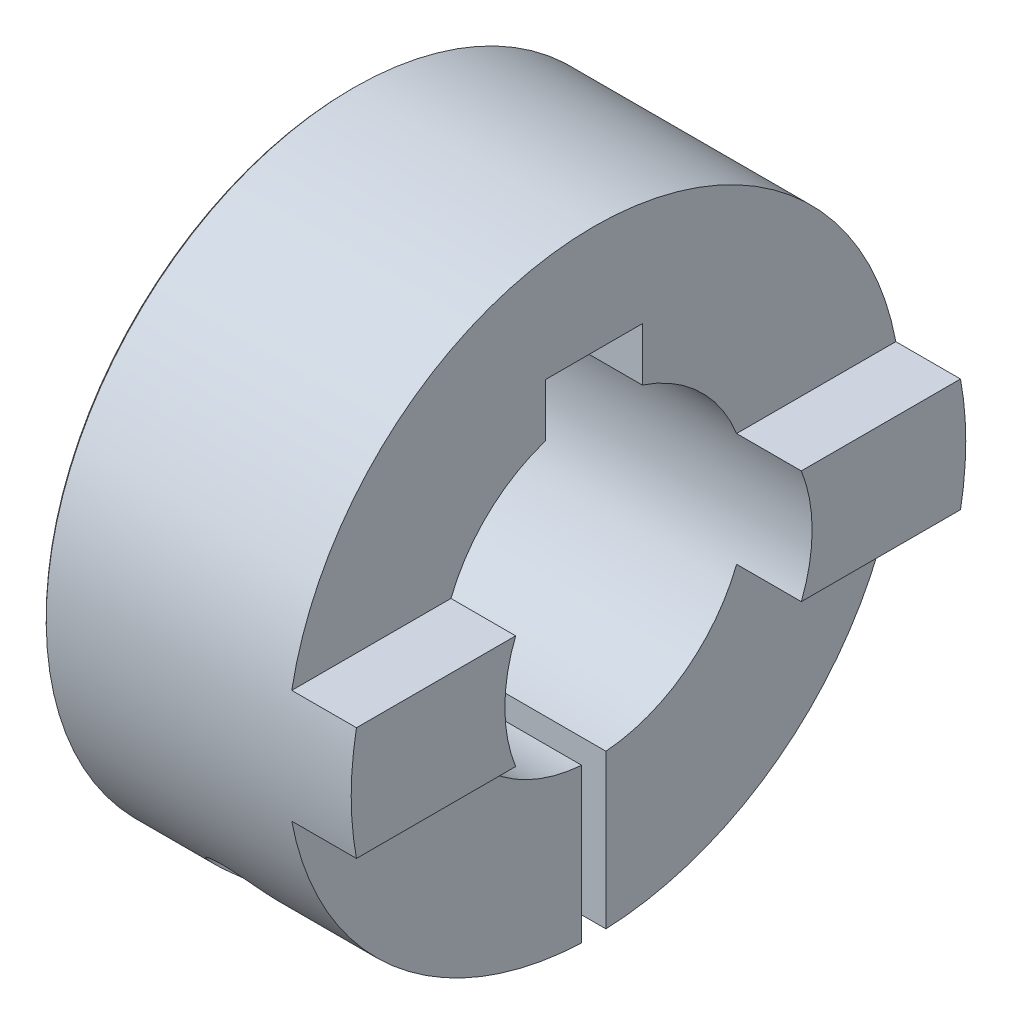
ISO-10303-21;
HEADER;
FILE_DESCRIPTION(('STEP AP214'),'2;1');
FILE_NAME('part.step','',(''),(''),'','','');
FILE_SCHEMA(('AUTOMOTIVE_DESIGN { 1 0 10303 214 1 1 1 1 }'));
ENDSEC;
DATA;
#1=APPLICATION_CONTEXT('core data for automotive mechanical design processes');
#2=APPLICATION_PROTOCOL_DEFINITION('international standard','automotive_design',2000,#1);
#3=PRODUCT_CONTEXT('',#1,'mechanical');
#4=PRODUCT('Part','Part','',(#3));
#5=PRODUCT_RELATED_PRODUCT_CATEGORY('part','',(#4));
#6=PRODUCT_DEFINITION_FORMATION('','',#4);
#7=PRODUCT_DEFINITION_CONTEXT('part definition',#1,'design');
#8=PRODUCT_DEFINITION('design','',#6,#7);
#9=PRODUCT_DEFINITION_SHAPE('','',#8);
#10=(LENGTH_UNIT() NAMED_UNIT(*) SI_UNIT(.MILLI.,.METRE.));
#11=(NAMED_UNIT(*) PLANE_ANGLE_UNIT() SI_UNIT($,.RADIAN.));
#12=(NAMED_UNIT(*) SI_UNIT($,.STERADIAN.) SOLID_ANGLE_UNIT());
#13=UNCERTAINTY_MEASURE_WITH_UNIT(LENGTH_MEASURE(1.E-05),#10,'distance_accuracy_value','');
#14=(GEOMETRIC_REPRESENTATION_CONTEXT(3) GLOBAL_UNCERTAINTY_ASSIGNED_CONTEXT((#13)) GLOBAL_UNIT_ASSIGNED_CONTEXT((#10,
#11,#12)) REPRESENTATION_CONTEXT('',''));
#15=CARTESIAN_POINT('',(0.,0.,0.));
#16=DIRECTION('',(0.,0.,1.));
#17=DIRECTION('',(1.,0.,0.));
#18=AXIS2_PLACEMENT_3D('',#15,#16,#17);
#19=CARTESIAN_POINT('',(0.,0.,0.));
#20=DIRECTION('',(1.,0.,0.));
#21=DIRECTION('',(0.,0.,-1.));
#22=AXIS2_PLACEMENT_3D('',#19,#20,#21);
#23=PLANE('',#22);
#24=DIRECTION('',(0.,1.,0.));
#25=VECTOR('',#24,1.);
#26=CARTESIAN_POINT('',(0.,9.01387818865997,-3.));
#27=LINE('',#26,#25);
#28=CARTESIAN_POINT('',(0.,12.3,-3.));
#29=VERTEX_POINT('',#28);
#30=CARTESIAN_POINT('',(0.,9.01387818865997,-3.));
#31=VERTEX_POINT('',#30);
#32=EDGE_CURVE('E239',#29,#31,#27,.F.);
#33=ORIENTED_EDGE('',*,*,#32,.F.);
#34=DIRECTION('',(0.,0.,-1.));
#35=VECTOR('',#34,1.);
#36=CARTESIAN_POINT('',(0.,12.3,-3.));
#37=LINE('',#36,#35);
#38=CARTESIAN_POINT('',(0.,12.3,3.));
#39=VERTEX_POINT('',#38);
#40=EDGE_CURVE('E250',#39,#29,#37,.T.);
#41=ORIENTED_EDGE('',*,*,#40,.F.);
#42=DIRECTION('',(0.,1.,0.));
#43=VECTOR('',#42,1.);
#44=CARTESIAN_POINT('',(0.,12.3,3.));
#45=LINE('',#44,#43);
#46=CARTESIAN_POINT('',(0.,9.01387818865997,3.));
#47=VERTEX_POINT('',#46);
#48=EDGE_CURVE('E112',#47,#39,#45,.T.);
#49=ORIENTED_EDGE('',*,*,#48,.F.);
#50=CARTESIAN_POINT('',(0.,0.,0.));
#51=DIRECTION('',(1.,0.,0.));
#52=DIRECTION('',(0.,0.,-1.));
#53=AXIS2_PLACEMENT_3D('',#50,#51,#52);
#54=CIRCLE('',#53,9.5);
#55=CARTESIAN_POINT('',(0.,-9.47034846243791,0.75));
#56=VERTEX_POINT('',#55);
#57=EDGE_CURVE('E20',#47,#56,#54,.T.);
#58=ORIENTED_EDGE('',*,*,#57,.T.);
#59=DIRECTION('',(0.,1.,0.));
#60=VECTOR('',#59,1.);
#61=CARTESIAN_POINT('',(0.,0.,0.75));
#62=LINE('',#61,#60);
#63=CARTESIAN_POINT('',(0.,-18.8436591049161,0.75));
#64=VERTEX_POINT('',#63);
#65=EDGE_CURVE('E215',#56,#64,#62,.F.);
#66=ORIENTED_EDGE('',*,*,#65,.T.);
#67=CARTESIAN_POINT('',(0.,0.,0.));
#68=DIRECTION('',(1.,0.,0.));
#69=DIRECTION('',(0.,0.,-1.));
#70=AXIS2_PLACEMENT_3D('',#67,#68,#69);
#71=CIRCLE('',#70,18.8585786437443);
#72=CARTESIAN_POINT('',(0.,-18.8436591049161,-0.75));
#73=VERTEX_POINT('',#72);
#74=EDGE_CURVE('E216',#73,#64,#71,.T.);
#75=ORIENTED_EDGE('',*,*,#74,.F.);
#76=DIRECTION('',(0.,1.,0.));
#77=VECTOR('',#76,1.);
#78=CARTESIAN_POINT('',(0.,-19.,-0.75));
#79=LINE('',#78,#77);
#80=CARTESIAN_POINT('',(0.,-9.47034846243791,-0.75));
#81=VERTEX_POINT('',#80);
#82=EDGE_CURVE('E154',#73,#81,#79,.T.);
#83=ORIENTED_EDGE('',*,*,#82,.T.);
#84=CARTESIAN_POINT('',(0.,0.,0.));
#85=DIRECTION('',(1.,0.,0.));
#86=DIRECTION('',(0.,0.,-1.));
#87=AXIS2_PLACEMENT_3D('',#84,#85,#86);
#88=CIRCLE('',#87,9.5);
#89=EDGE_CURVE('E238',#81,#31,#88,.T.);
#90=ORIENTED_EDGE('',*,*,#89,.T.);
#91=EDGE_LOOP('',(#33,#41,#49,#58,#66,#75,#83,#90));
#92=FACE_BOUND('',#91,.T.);
#93=ADVANCED_FACE('F17',(#92),#23,.F.);
#94=CARTESIAN_POINT('',(19.,0.,0.));
#95=DIRECTION('',(1.,0.,0.));
#96=DIRECTION('',(0.,0.,-1.));
#97=AXIS2_PLACEMENT_3D('',#94,#95,#96);
#98=CYLINDRICAL_SURFACE('',#97,9.5);
#99=DIRECTION('',(1.,0.,0.));
#100=VECTOR('',#99,1.);
#101=CARTESIAN_POINT('',(0.,-9.47034846243791,0.75));
#102=LINE('',#101,#100);
#103=CARTESIAN_POINT('',(15.,-9.47034846243791,0.75));
#104=VERTEX_POINT('',#103);
#105=EDGE_CURVE('E214',#104,#56,#102,.F.);
#106=ORIENTED_EDGE('',*,*,#105,.T.);
#107=ORIENTED_EDGE('',*,*,#57,.F.);
#108=DIRECTION('',(-1.,0.,0.));
#109=VECTOR('',#108,1.);
#110=CARTESIAN_POINT('',(19.,9.01387818865997,3.));
#111=LINE('',#110,#109);
#112=CARTESIAN_POINT('',(15.,9.01387818865997,3.));
#113=VERTEX_POINT('',#112);
#114=EDGE_CURVE('E262',#113,#47,#111,.T.);
#115=ORIENTED_EDGE('',*,*,#114,.F.);
#116=CARTESIAN_POINT('',(15.,0.,0.));
#117=DIRECTION('',(1.,0.,0.));
#118=DIRECTION('',(0.,0.,-1.));
#119=AXIS2_PLACEMENT_3D('',#116,#117,#118);
#120=CIRCLE('',#119,9.5);
#121=CARTESIAN_POINT('',(15.,3.5,8.83176086632785));
#122=VERTEX_POINT('',#121);
#123=EDGE_CURVE('E193',#122,#113,#120,.F.);
#124=ORIENTED_EDGE('',*,*,#123,.F.);
#125=DIRECTION('',(1.,0.,0.));
#126=VECTOR('',#125,1.);
#127=CARTESIAN_POINT('',(15.,3.5,8.83176086632785));
#128=LINE('',#127,#126);
#129=CARTESIAN_POINT('',(19.,3.5,8.83176086632785));
#130=VERTEX_POINT('',#129);
#131=EDGE_CURVE('E316',#130,#122,#128,.F.);
#132=ORIENTED_EDGE('',*,*,#131,.F.);
#133=CARTESIAN_POINT('',(19.,0.,0.));
#134=DIRECTION('',(1.,0.,0.));
#135=DIRECTION('',(0.,0.,-1.));
#136=AXIS2_PLACEMENT_3D('',#133,#134,#135);
#137=CIRCLE('',#136,9.5);
#138=CARTESIAN_POINT('',(19.,-3.5,8.83176086632785));
#139=VERTEX_POINT('',#138);
#140=EDGE_CURVE('E198',#130,#139,#137,.T.);
#141=ORIENTED_EDGE('',*,*,#140,.T.);
#142=DIRECTION('',(1.,0.,0.));
#143=VECTOR('',#142,1.);
#144=CARTESIAN_POINT('',(15.,-3.5,8.83176086632785));
#145=LINE('',#144,#143);
#146=CARTESIAN_POINT('',(15.,-3.5,8.83176086632785));
#147=VERTEX_POINT('',#146);
#148=EDGE_CURVE('E325',#147,#139,#145,.T.);
#149=ORIENTED_EDGE('',*,*,#148,.F.);
#150=CARTESIAN_POINT('',(15.,0.,0.));
#151=DIRECTION('',(1.,0.,0.));
#152=DIRECTION('',(0.,0.,-1.));
#153=AXIS2_PLACEMENT_3D('',#150,#151,#152);
#154=CIRCLE('',#153,9.5);
#155=EDGE_CURVE('E203',#104,#147,#154,.F.);
#156=ORIENTED_EDGE('',*,*,#155,.F.);
#157=EDGE_LOOP('',(#106,#107,#115,#124,#132,#141,#149,#156));
#158=FACE_BOUND('',#157,.T.);
#159=ADVANCED_FACE('F406',(#158),#98,.F.);
#160=CARTESIAN_POINT('',(19.,12.3,3.));
#161=DIRECTION('',(0.,0.,-1.));
#162=DIRECTION('',(-1.,0.,0.));
#163=AXIS2_PLACEMENT_3D('',#160,#161,#162);
#164=PLANE('',#163);
#165=DIRECTION('',(1.,0.,0.));
#166=VECTOR('',#165,1.);
#167=CARTESIAN_POINT('',(19.,12.3,3.));
#168=LINE('',#167,#166);
#169=CARTESIAN_POINT('',(15.,12.3,3.));
#170=VERTEX_POINT('',#169);
#171=EDGE_CURVE('E258',#170,#39,#168,.F.);
#172=ORIENTED_EDGE('',*,*,#171,.F.);
#173=DIRECTION('',(0.,1.,0.));
#174=VECTOR('',#173,1.);
#175=CARTESIAN_POINT('',(15.,0.,3.));
#176=LINE('',#175,#174);
#177=EDGE_CURVE('E196',#113,#170,#176,.T.);
#178=ORIENTED_EDGE('',*,*,#177,.F.);
#179=ORIENTED_EDGE('',*,*,#114,.T.);
#180=ORIENTED_EDGE('',*,*,#48,.T.);
#181=EDGE_LOOP('',(#172,#178,#179,#180));
#182=FACE_BOUND('',#181,.T.);
#183=ADVANCED_FACE('F402',(#182),#164,.T.);
#184=CARTESIAN_POINT('',(19.,12.3,-3.));
#185=DIRECTION('',(0.,-1.,0.));
#186=DIRECTION('',(0.,0.,-1.));
#187=AXIS2_PLACEMENT_3D('',#184,#185,#186);
#188=PLANE('',#187);
#189=DIRECTION('',(1.,0.,0.));
#190=VECTOR('',#189,1.);
#191=CARTESIAN_POINT('',(19.,12.3,-3.));
#192=LINE('',#191,#190);
#193=CARTESIAN_POINT('',(15.,12.3,-3.));
#194=VERTEX_POINT('',#193);
#195=EDGE_CURVE('E245',#194,#29,#192,.F.);
#196=ORIENTED_EDGE('',*,*,#195,.F.);
#197=DIRECTION('',(0.,0.,-1.));
#198=VECTOR('',#197,1.);
#199=CARTESIAN_POINT('',(15.,12.3,0.));
#200=LINE('',#199,#198);
#201=EDGE_CURVE('E307',#170,#194,#200,.T.);
#202=ORIENTED_EDGE('',*,*,#201,.F.);
#203=ORIENTED_EDGE('',*,*,#171,.T.);
#204=ORIENTED_EDGE('',*,*,#40,.T.);
#205=EDGE_LOOP('',(#196,#202,#203,#204));
#206=FACE_BOUND('',#205,.T.);
#207=ADVANCED_FACE('F403',(#206),#188,.T.);
#208=CARTESIAN_POINT('',(19.,9.01387818865997,-3.));
#209=DIRECTION('',(0.,0.,1.));
#210=DIRECTION('',(1.,0.,0.));
#211=AXIS2_PLACEMENT_3D('',#208,#209,#210);
#212=PLANE('',#211);
#213=DIRECTION('',(1.,0.,0.));
#214=VECTOR('',#213,1.);
#215=CARTESIAN_POINT('',(19.,9.01387818865997,-3.));
#216=LINE('',#215,#214);
#217=CARTESIAN_POINT('',(15.,9.01387818865997,-3.));
#218=VERTEX_POINT('',#217);
#219=EDGE_CURVE('E237',#31,#218,#216,.T.);
#220=ORIENTED_EDGE('',*,*,#219,.T.);
#221=DIRECTION('',(0.,1.,0.));
#222=VECTOR('',#221,1.);
#223=CARTESIAN_POINT('',(15.,0.,-3.));
#224=LINE('',#223,#222);
#225=EDGE_CURVE('E192',#194,#218,#224,.F.);
#226=ORIENTED_EDGE('',*,*,#225,.F.);
#227=ORIENTED_EDGE('',*,*,#195,.T.);
#228=ORIENTED_EDGE('',*,*,#32,.T.);
#229=EDGE_LOOP('',(#220,#226,#227,#228));
#230=FACE_BOUND('',#229,.T.);
#231=ADVANCED_FACE('F397',(#230),#212,.T.);
#232=CARTESIAN_POINT('',(19.,0.,0.));
#233=DIRECTION('',(1.,0.,0.));
#234=DIRECTION('',(0.,0.,-1.));
#235=AXIS2_PLACEMENT_3D('',#232,#233,#234);
#236=CYLINDRICAL_SURFACE('',#235,9.5);
#237=DIRECTION('',(1.,0.,0.));
#238=VECTOR('',#237,1.);
#239=CARTESIAN_POINT('',(15.,3.5,-8.83176086632785));
#240=LINE('',#239,#238);
#241=CARTESIAN_POINT('',(15.,3.5,-8.83176086632785));
#242=VERTEX_POINT('',#241);
#243=CARTESIAN_POINT('',(19.,3.5,-8.83176086632785));
#244=VERTEX_POINT('',#243);
#245=EDGE_CURVE('E304',#242,#244,#240,.T.);
#246=ORIENTED_EDGE('',*,*,#245,.F.);
#247=CARTESIAN_POINT('',(15.,0.,0.));
#248=DIRECTION('',(1.,0.,0.));
#249=DIRECTION('',(0.,0.,-1.));
#250=AXIS2_PLACEMENT_3D('',#247,#248,#249);
#251=CIRCLE('',#250,9.5);
#252=EDGE_CURVE('E189',#218,#242,#251,.F.);
#253=ORIENTED_EDGE('',*,*,#252,.F.);
#254=ORIENTED_EDGE('',*,*,#219,.F.);
#255=ORIENTED_EDGE('',*,*,#89,.F.);
#256=DIRECTION('',(-1.,0.,0.));
#257=VECTOR('',#256,1.);
#258=CARTESIAN_POINT('',(0.,-9.47034846243791,-0.75));
#259=LINE('',#258,#257);
#260=CARTESIAN_POINT('',(15.,-9.47034846243791,-0.75));
#261=VERTEX_POINT('',#260);
#262=EDGE_CURVE('E236',#81,#261,#259,.F.);
#263=ORIENTED_EDGE('',*,*,#262,.T.);
#264=CARTESIAN_POINT('',(15.,0.,0.));
#265=DIRECTION('',(1.,0.,0.));
#266=DIRECTION('',(0.,0.,-1.));
#267=AXIS2_PLACEMENT_3D('',#264,#265,#266);
#268=CIRCLE('',#267,9.5);
#269=CARTESIAN_POINT('',(15.,-3.5,-8.83176086632785));
#270=VERTEX_POINT('',#269);
#271=EDGE_CURVE('E150',#270,#261,#268,.F.);
#272=ORIENTED_EDGE('',*,*,#271,.F.);
#273=DIRECTION('',(1.,0.,0.));
#274=VECTOR('',#273,1.);
#275=CARTESIAN_POINT('',(15.,-3.5,-8.83176086632785));
#276=LINE('',#275,#274);
#277=CARTESIAN_POINT('',(19.,-3.5,-8.83176086632785));
#278=VERTEX_POINT('',#277);
#279=EDGE_CURVE('E301',#278,#270,#276,.F.);
#280=ORIENTED_EDGE('',*,*,#279,.F.);
#281=CARTESIAN_POINT('',(19.,0.,0.));
#282=DIRECTION('',(1.,0.,0.));
#283=DIRECTION('',(0.,0.,-1.));
#284=AXIS2_PLACEMENT_3D('',#281,#282,#283);
#285=CIRCLE('',#284,9.5);
#286=EDGE_CURVE('E184',#278,#244,#285,.T.);
#287=ORIENTED_EDGE('',*,*,#286,.T.);
#288=EDGE_LOOP('',(#246,#253,#254,#255,#263,#272,#280,#287));
#289=FACE_BOUND('',#288,.T.);
#290=ADVANCED_FACE('F358',(#289),#236,.F.);
#291=CARTESIAN_POINT('',(7.,-13.7,19.));
#292=DIRECTION('',(0.,0.,-1.));
#293=DIRECTION('',(-1.,0.,0.));
#294=AXIS2_PLACEMENT_3D('',#291,#292,#293);
#295=CYLINDRICAL_SURFACE('',#294,2.5);
#296=CARTESIAN_POINT('',(7.,-13.7,-9.1));
#297=DIRECTION('',(0.,0.,-1.));
#298=DIRECTION('',(-1.,0.,0.));
#299=AXIS2_PLACEMENT_3D('',#296,#297,#298);
#300=CIRCLE('',#299,2.5);
#301=CARTESIAN_POINT('',(4.5,-13.7,-9.1));
#302=VERTEX_POINT('',#301);
#303=EDGE_CURVE('E174',#302,#302,#300,.F.);
#304=ORIENTED_EDGE('',*,*,#303,.F.);
#305=EDGE_LOOP('',(#304));
#306=FACE_BOUND('',#305,.T.);
#307=CARTESIAN_POINT('',(7.,-13.7,-0.750000000000001));
#308=DIRECTION('',(0.,0.,-1.));
#309=DIRECTION('',(-1.,0.,0.));
#310=AXIS2_PLACEMENT_3D('',#307,#308,#309);
#311=CIRCLE('',#310,2.5);
#312=CARTESIAN_POINT('',(4.5,-13.7,-0.750000000000001));
#313=VERTEX_POINT('',#312);
#314=EDGE_CURVE('E233',#313,#313,#311,.F.);
#315=ORIENTED_EDGE('',*,*,#314,.T.);
#316=EDGE_LOOP('',(#315));
#317=FACE_BOUND('',#316,.T.);
#318=ADVANCED_FACE('F446',(#306,#317),#295,.F.);
#319=CARTESIAN_POINT('',(15.,0.,0.));
#320=DIRECTION('',(1.,0.,0.));
#321=DIRECTION('',(0.,0.,-1.));
#322=AXIS2_PLACEMENT_3D('',#319,#320,#321);
#323=PLANE('',#322);
#324=DIRECTION('',(0.,1.,0.));
#325=VECTOR('',#324,1.);
#326=CARTESIAN_POINT('',(15.,-19.,-0.75));
#327=LINE('',#326,#325);
#328=CARTESIAN_POINT('',(15.,-18.9851915976637,-0.750000000000002));
#329=VERTEX_POINT('',#328);
#330=EDGE_CURVE('E147',#261,#329,#327,.F.);
#331=ORIENTED_EDGE('',*,*,#330,.T.);
#332=CARTESIAN_POINT('',(15.,0.,0.));
#333=DIRECTION('',(-1.,0.,0.));
#334=DIRECTION('',(0.,0.,1.));
#335=AXIS2_PLACEMENT_3D('',#332,#333,#334);
#336=CIRCLE('',#335,19.);
#337=CARTESIAN_POINT('',(15.,-3.5,-18.6748493969831));
#338=VERTEX_POINT('',#337);
#339=EDGE_CURVE('E144',#338,#329,#336,.T.);
#340=ORIENTED_EDGE('',*,*,#339,.F.);
#341=DIRECTION('',(0.,0.,-1.));
#342=VECTOR('',#341,1.);
#343=CARTESIAN_POINT('',(15.,-3.5,19.));
#344=LINE('',#343,#342);
#345=EDGE_CURVE('E183',#270,#338,#344,.T.);
#346=ORIENTED_EDGE('',*,*,#345,.F.);
#347=ORIENTED_EDGE('',*,*,#271,.T.);
#348=EDGE_LOOP('',(#331,#340,#346,#347));
#349=FACE_BOUND('',#348,.T.);
#350=ADVANCED_FACE('F149',(#349),#323,.T.);
#351=CARTESIAN_POINT('',(0.,-19.,-0.75));
#352=DIRECTION('',(0.,0.,-1.));
#353=DIRECTION('',(-1.,0.,0.));
#354=AXIS2_PLACEMENT_3D('',#351,#352,#353);
#355=PLANE('',#354);
#356=ORIENTED_EDGE('',*,*,#314,.F.);
#357=EDGE_LOOP('',(#356));
#358=FACE_BOUND('',#357,.T.);
#359=ORIENTED_EDGE('',*,*,#82,.F.);
#360=CARTESIAN_POINT('',(0.141421356253833,-18.9851915976618,-0.75));
#361=CARTESIAN_POINT('',(0.117851060938541,-18.9616029180907,-0.75));
#362=CARTESIAN_POINT('',(0.0942808002600496,-18.93801420391,-0.75));
#363=CARTESIAN_POINT('',(0.0471403481766664,-18.8908367063293,-0.75));
#364=CARTESIAN_POINT('',(0.0235701567717749,-18.8672479229294,-0.75));
#365=CARTESIAN_POINT('',(3.68341027826213E-12,-18.8436591049198,-0.75));
#366=B_SPLINE_CURVE_WITH_KNOTS('',3,(#360,#361,#362,#363,#364,#365),.UNSPECIFIED.,.F.,.F.,(4,2,
4),(0.,0.100039300409244,0.200078600818489),.UNSPECIFIED.);
#367=CARTESIAN_POINT('',(0.141421356245568,-18.9851915976628,-0.750000000000002));
#368=VERTEX_POINT('',#367);
#369=EDGE_CURVE('E160',#368,#73,#366,.T.);
#370=ORIENTED_EDGE('',*,*,#369,.F.);
#371=DIRECTION('',(-1.,0.,0.));
#372=VECTOR('',#371,1.);
#373=CARTESIAN_POINT('',(19.,-18.9851915976637,-0.750000000000004));
#374=LINE('',#373,#372);
#375=EDGE_CURVE('E157',#329,#368,#374,.T.);
#376=ORIENTED_EDGE('',*,*,#375,.F.);
#377=ORIENTED_EDGE('',*,*,#330,.F.);
#378=ORIENTED_EDGE('',*,*,#262,.F.);
#379=EDGE_LOOP('',(#359,#370,#376,#377,#378));
#380=FACE_BOUND('',#379,.T.);
#381=ADVANCED_FACE('F158',(#358,#380),#355,.F.);
#382=CARTESIAN_POINT('',(0.141421356261162,0.,0.));
#383=DIRECTION('',(1.,0.,0.));
#384=DIRECTION('',(0.,0.,-1.));
#385=AXIS2_PLACEMENT_3D('',#382,#383,#384);
#386=CONICAL_SURFACE('',#385,19.0000000000055,0.785398163397448);
#387=ORIENTED_EDGE('',*,*,#74,.T.);
#388=CARTESIAN_POINT('',(7.35837430134256E-12,-18.8436591049235,0.75));
#389=CARTESIAN_POINT('',(0.0235701567736167,-18.8672479229312,0.75));
#390=CARTESIAN_POINT('',(0.0471403481766755,-18.8908367063293,0.75));
#391=CARTESIAN_POINT('',(0.0942808002563937,-18.9380142039063,0.75));
#392=CARTESIAN_POINT('',(0.117851060933053,-18.9616029180852,0.75));
#393=CARTESIAN_POINT('',(0.141421356246513,-18.9851915976545,0.75));
#394=B_SPLINE_CURVE_WITH_KNOTS('',3,(#388,#389,#390,#391,#392,#393),.UNSPECIFIED.,.F.,.F.,(4,2,
4),(0.,0.100039300401466,0.200078600802933),.UNSPECIFIED.);
#395=CARTESIAN_POINT('',(0.141421356241907,-18.9851915976591,0.749999999999998));
#396=VERTEX_POINT('',#395);
#397=EDGE_CURVE('E207',#64,#396,#394,.T.);
#398=ORIENTED_EDGE('',*,*,#397,.T.);
#399=CARTESIAN_POINT('',(0.141421356237303,0.,0.));
#400=DIRECTION('',(-1.,0.,0.));
#401=DIRECTION('',(0.,0.,1.));
#402=AXIS2_PLACEMENT_3D('',#399,#400,#401);
#403=CIRCLE('',#402,19.);
#404=EDGE_CURVE('E164',#368,#396,#403,.F.);
#405=ORIENTED_EDGE('',*,*,#404,.F.);
#406=ORIENTED_EDGE('',*,*,#369,.T.);
#407=EDGE_LOOP('',(#387,#398,#405,#406));
#408=FACE_BOUND('',#407,.T.);
#409=ADVANCED_FACE('F221',(#408),#386,.T.);
#410=CARTESIAN_POINT('',(0.,0.,0.75));
#411=DIRECTION('',(0.,0.,1.));
#412=DIRECTION('',(1.,0.,0.));
#413=AXIS2_PLACEMENT_3D('',#410,#411,#412);
#414=PLANE('',#413);
#415=CARTESIAN_POINT('',(7.,-13.7,0.750000000000001));
#416=DIRECTION('',(0.,0.,-1.));
#417=DIRECTION('',(-1.,0.,0.));
#418=AXIS2_PLACEMENT_3D('',#415,#416,#417);
#419=CIRCLE('',#418,2.067);
#420=CARTESIAN_POINT('',(4.933,-13.7,0.750000000000001));
#421=VERTEX_POINT('',#420);
#422=EDGE_CURVE('E171',#421,#421,#419,.F.);
#423=ORIENTED_EDGE('',*,*,#422,.T.);
#424=EDGE_LOOP('',(#423));
#425=FACE_BOUND('',#424,.T.);
#426=DIRECTION('',(0.,1.,0.));
#427=VECTOR('',#426,1.);
#428=CARTESIAN_POINT('',(15.,0.,0.75));
#429=LINE('',#428,#427);
#430=CARTESIAN_POINT('',(15.,-18.9851915976637,0.749999999999998));
#431=VERTEX_POINT('',#430);
#432=EDGE_CURVE('E206',#431,#104,#429,.T.);
#433=ORIENTED_EDGE('',*,*,#432,.F.);
#434=DIRECTION('',(-1.,0.,0.));
#435=VECTOR('',#434,1.);
#436=CARTESIAN_POINT('',(19.,-18.9851915976637,0.749999999999997));
#437=LINE('',#436,#435);
#438=EDGE_CURVE('E333',#396,#431,#437,.F.);
#439=ORIENTED_EDGE('',*,*,#438,.F.);
#440=ORIENTED_EDGE('',*,*,#397,.F.);
#441=ORIENTED_EDGE('',*,*,#65,.F.);
#442=ORIENTED_EDGE('',*,*,#105,.F.);
#443=EDGE_LOOP('',(#433,#439,#440,#441,#442));
#444=FACE_BOUND('',#443,.T.);
#445=ADVANCED_FACE('F218',(#425,#444),#414,.F.);
#446=CARTESIAN_POINT('',(15.,0.,0.));
#447=DIRECTION('',(1.,0.,0.));
#448=DIRECTION('',(0.,0.,-1.));
#449=AXIS2_PLACEMENT_3D('',#446,#447,#448);
#450=PLANE('',#449);
#451=DIRECTION('',(0.,0.,-1.));
#452=VECTOR('',#451,1.);
#453=CARTESIAN_POINT('',(15.,-3.5,19.));
#454=LINE('',#453,#452);
#455=CARTESIAN_POINT('',(15.,-3.5,18.6748493969831));
#456=VERTEX_POINT('',#455);
#457=EDGE_CURVE('E205',#456,#147,#454,.T.);
#458=ORIENTED_EDGE('',*,*,#457,.F.);
#459=CARTESIAN_POINT('',(15.,0.,0.));
#460=DIRECTION('',(-1.,0.,0.));
#461=DIRECTION('',(0.,0.,1.));
#462=AXIS2_PLACEMENT_3D('',#459,#460,#461);
#463=CIRCLE('',#462,19.);
#464=EDGE_CURVE('E177',#431,#456,#463,.T.);
#465=ORIENTED_EDGE('',*,*,#464,.F.);
#466=ORIENTED_EDGE('',*,*,#432,.T.);
#467=ORIENTED_EDGE('',*,*,#155,.T.);
#468=EDGE_LOOP('',(#458,#465,#466,#467));
#469=FACE_BOUND('',#468,.T.);
#470=ADVANCED_FACE('F369',(#469),#450,.T.);
#471=CARTESIAN_POINT('',(15.,-3.5,19.));
#472=DIRECTION('',(0.,-1.,0.));
#473=DIRECTION('',(0.,0.,-1.));
#474=AXIS2_PLACEMENT_3D('',#471,#472,#473);
#475=PLANE('',#474);
#476=DIRECTION('',(0.,0.,1.));
#477=VECTOR('',#476,1.);
#478=CARTESIAN_POINT('',(19.,-3.5,0.));
#479=LINE('',#478,#477);
#480=CARTESIAN_POINT('',(19.,-3.5,18.6748493969831));
#481=VERTEX_POINT('',#480);
#482=EDGE_CURVE('E202',#139,#481,#479,.T.);
#483=ORIENTED_EDGE('',*,*,#482,.T.);
#484=DIRECTION('',(-1.,0.,0.));
#485=VECTOR('',#484,1.);
#486=CARTESIAN_POINT('',(19.,-3.5,18.6748493969831));
#487=LINE('',#486,#485);
#488=EDGE_CURVE('E326',#456,#481,#487,.F.);
#489=ORIENTED_EDGE('',*,*,#488,.F.);
#490=ORIENTED_EDGE('',*,*,#457,.T.);
#491=ORIENTED_EDGE('',*,*,#148,.T.);
#492=EDGE_LOOP('',(#483,#489,#490,#491));
#493=FACE_BOUND('',#492,.T.);
#494=ADVANCED_FACE('F373',(#493),#475,.T.);
#495=CARTESIAN_POINT('',(19.,19.,0.));
#496=DIRECTION('',(-1.,0.,0.));
#497=DIRECTION('',(0.,0.,1.));
#498=AXIS2_PLACEMENT_3D('',#495,#496,#497);
#499=PLANE('',#498);
#500=DIRECTION('',(0.,0.,1.));
#501=VECTOR('',#500,1.);
#502=CARTESIAN_POINT('',(19.,3.5,-19.));
#503=LINE('',#502,#501);
#504=CARTESIAN_POINT('',(19.,3.5,18.6748493969831));
#505=VERTEX_POINT('',#504);
#506=EDGE_CURVE('E201',#505,#130,#503,.F.);
#507=ORIENTED_EDGE('',*,*,#506,.F.);
#508=CARTESIAN_POINT('',(19.,0.,0.));
#509=DIRECTION('',(-1.,0.,0.));
#510=DIRECTION('',(0.,0.,1.));
#511=AXIS2_PLACEMENT_3D('',#508,#509,#510);
#512=CIRCLE('',#511,19.);
#513=EDGE_CURVE('E321',#481,#505,#512,.T.);
#514=ORIENTED_EDGE('',*,*,#513,.F.);
#515=ORIENTED_EDGE('',*,*,#482,.F.);
#516=ORIENTED_EDGE('',*,*,#140,.F.);
#517=EDGE_LOOP('',(#507,#514,#515,#516));
#518=FACE_BOUND('',#517,.T.);
#519=ADVANCED_FACE('F409',(#518),#499,.F.);
#520=CARTESIAN_POINT('',(15.,3.5,-19.));
#521=DIRECTION('',(0.,1.,0.));
#522=DIRECTION('',(0.,0.,1.));
#523=AXIS2_PLACEMENT_3D('',#520,#521,#522);
#524=PLANE('',#523);
#525=DIRECTION('',(0.,0.,-1.));
#526=VECTOR('',#525,1.);
#527=CARTESIAN_POINT('',(15.,3.5,0.));
#528=LINE('',#527,#526);
#529=CARTESIAN_POINT('',(15.,3.5,18.6748493969831));
#530=VERTEX_POINT('',#529);
#531=EDGE_CURVE('E197',#530,#122,#528,.T.);
#532=ORIENTED_EDGE('',*,*,#531,.F.);
#533=DIRECTION('',(-1.,0.,0.));
#534=VECTOR('',#533,1.);
#535=CARTESIAN_POINT('',(19.,3.5,18.6748493969831));
#536=LINE('',#535,#534);
#537=EDGE_CURVE('E317',#505,#530,#536,.T.);
#538=ORIENTED_EDGE('',*,*,#537,.F.);
#539=ORIENTED_EDGE('',*,*,#506,.T.);
#540=ORIENTED_EDGE('',*,*,#131,.T.);
#541=EDGE_LOOP('',(#532,#538,#539,#540));
#542=FACE_BOUND('',#541,.T.);
#543=ADVANCED_FACE('F408',(#542),#524,.T.);
#544=CARTESIAN_POINT('',(15.,0.,0.));
#545=DIRECTION('',(1.,0.,0.));
#546=DIRECTION('',(0.,0.,-1.));
#547=AXIS2_PLACEMENT_3D('',#544,#545,#546);
#548=PLANE('',#547);
#549=DIRECTION('',(0.,0.,1.));
#550=VECTOR('',#549,1.);
#551=CARTESIAN_POINT('',(15.,3.5,-19.));
#552=LINE('',#551,#550);
#553=CARTESIAN_POINT('',(15.,3.5,-18.6748493969831));
#554=VERTEX_POINT('',#553);
#555=EDGE_CURVE('E191',#554,#242,#552,.T.);
#556=ORIENTED_EDGE('',*,*,#555,.F.);
#557=CARTESIAN_POINT('',(15.,0.,0.));
#558=DIRECTION('',(-1.,0.,0.));
#559=DIRECTION('',(0.,0.,1.));
#560=AXIS2_PLACEMENT_3D('',#557,#558,#559);
#561=CIRCLE('',#560,19.);
#562=EDGE_CURVE('E320',#530,#554,#561,.T.);
#563=ORIENTED_EDGE('',*,*,#562,.F.);
#564=ORIENTED_EDGE('',*,*,#531,.T.);
#565=ORIENTED_EDGE('',*,*,#123,.T.);
#566=ORIENTED_EDGE('',*,*,#177,.T.);
#567=ORIENTED_EDGE('',*,*,#201,.T.);
#568=ORIENTED_EDGE('',*,*,#225,.T.);
#569=ORIENTED_EDGE('',*,*,#252,.T.);
#570=EDGE_LOOP('',(#556,#563,#564,#565,#566,#567,#568,#569));
#571=FACE_BOUND('',#570,.T.);
#572=ADVANCED_FACE('F395',(#571),#548,.T.);
#573=CARTESIAN_POINT('',(15.,3.5,-19.));
#574=DIRECTION('',(0.,1.,0.));
#575=DIRECTION('',(0.,0.,1.));
#576=AXIS2_PLACEMENT_3D('',#573,#574,#575);
#577=PLANE('',#576);
#578=DIRECTION('',(0.,0.,1.));
#579=VECTOR('',#578,1.);
#580=CARTESIAN_POINT('',(19.,3.5,0.));
#581=LINE('',#580,#579);
#582=CARTESIAN_POINT('',(19.,3.5,-18.6748493969831));
#583=VERTEX_POINT('',#582);
#584=EDGE_CURVE('E188',#244,#583,#581,.F.);
#585=ORIENTED_EDGE('',*,*,#584,.T.);
#586=DIRECTION('',(-1.,0.,0.));
#587=VECTOR('',#586,1.);
#588=CARTESIAN_POINT('',(19.,3.5,-18.6748493969831));
#589=LINE('',#588,#587);
#590=EDGE_CURVE('E295',#554,#583,#589,.F.);
#591=ORIENTED_EDGE('',*,*,#590,.F.);
#592=ORIENTED_EDGE('',*,*,#555,.T.);
#593=ORIENTED_EDGE('',*,*,#245,.T.);
#594=EDGE_LOOP('',(#585,#591,#592,#593));
#595=FACE_BOUND('',#594,.T.);
#596=ADVANCED_FACE('F386',(#595),#577,.T.);
#597=CARTESIAN_POINT('',(19.,19.,0.));
#598=DIRECTION('',(-1.,0.,0.));
#599=DIRECTION('',(0.,0.,1.));
#600=AXIS2_PLACEMENT_3D('',#597,#598,#599);
#601=PLANE('',#600);
#602=DIRECTION('',(0.,0.,-1.));
#603=VECTOR('',#602,1.);
#604=CARTESIAN_POINT('',(19.,-3.5,19.));
#605=LINE('',#604,#603);
#606=CARTESIAN_POINT('',(19.,-3.5,-18.6748493969831));
#607=VERTEX_POINT('',#606);
#608=EDGE_CURVE('E187',#607,#278,#605,.F.);
#609=ORIENTED_EDGE('',*,*,#608,.F.);
#610=CARTESIAN_POINT('',(19.,0.,0.));
#611=DIRECTION('',(-1.,0.,0.));
#612=DIRECTION('',(0.,0.,1.));
#613=AXIS2_PLACEMENT_3D('',#610,#611,#612);
#614=CIRCLE('',#613,19.);
#615=EDGE_CURVE('E293',#583,#607,#614,.T.);
#616=ORIENTED_EDGE('',*,*,#615,.F.);
#617=ORIENTED_EDGE('',*,*,#584,.F.);
#618=ORIENTED_EDGE('',*,*,#286,.F.);
#619=EDGE_LOOP('',(#609,#616,#617,#618));
#620=FACE_BOUND('',#619,.T.);
#621=ADVANCED_FACE('F389',(#620),#601,.F.);
#622=CARTESIAN_POINT('',(15.,-3.5,19.));
#623=DIRECTION('',(0.,-1.,0.));
#624=DIRECTION('',(0.,0.,-1.));
#625=AXIS2_PLACEMENT_3D('',#622,#623,#624);
#626=PLANE('',#625);
#627=ORIENTED_EDGE('',*,*,#345,.T.);
#628=DIRECTION('',(-1.,0.,0.));
#629=VECTOR('',#628,1.);
#630=CARTESIAN_POINT('',(19.,-3.5,-18.6748493969831));
#631=LINE('',#630,#629);
#632=EDGE_CURVE('E170',#607,#338,#631,.T.);
#633=ORIENTED_EDGE('',*,*,#632,.F.);
#634=ORIENTED_EDGE('',*,*,#608,.T.);
#635=ORIENTED_EDGE('',*,*,#279,.T.);
#636=EDGE_LOOP('',(#627,#633,#634,#635));
#637=FACE_BOUND('',#636,.T.);
#638=ADVANCED_FACE('F391',(#637),#626,.T.);
#639=CARTESIAN_POINT('',(7.,-13.7,19.));
#640=DIRECTION('',(0.,0.,-1.));
#641=DIRECTION('',(-1.,0.,0.));
#642=AXIS2_PLACEMENT_3D('',#639,#640,#641);
#643=CYLINDRICAL_SURFACE('',#642,4.3);
#644=CARTESIAN_POINT('',(7.,-13.7,-9.1));
#645=DIRECTION('',(0.,0.,-1.));
#646=DIRECTION('',(-1.,0.,0.));
#647=AXIS2_PLACEMENT_3D('',#644,#645,#646);
#648=CIRCLE('',#647,4.3);
#649=CARTESIAN_POINT('',(3.89913113556669,-16.6790287487012,-9.09999999999999));
#650=VERTEX_POINT('',#649);
#651=CARTESIAN_POINT('',(10.1008688644333,-16.6790287487012,-9.09999999999999));
#652=VERTEX_POINT('',#651);
#653=EDGE_CURVE('E34',#650,#652,#648,.T.);
#654=ORIENTED_EDGE('',*,*,#653,.F.);
#655=CARTESIAN_POINT('',(10.1008688644333,-16.6790287487012,-9.09999999999998));
#656=CARTESIAN_POINT('',(10.1692983501493,-16.6077767058739,-9.23060232200894));
#657=CARTESIAN_POINT('',(10.235088565651,-16.5344045529921,-9.36142773399902));
#658=CARTESIAN_POINT('',(10.3613876761894,-16.383430277395,-9.62320157720109));
#659=CARTESIAN_POINT('',(10.4218961995207,-16.3058278575929,-9.75415001641682));
#660=CARTESIAN_POINT('',(10.5377469933564,-16.1462377225001,-10.0161165405155));
#661=CARTESIAN_POINT('',(10.5930775885362,-16.0642407227197,-10.1471341432695));
#662=CARTESIAN_POINT('',(10.6982735656601,-15.8960441749996,-10.4086482368111));
#663=CARTESIAN_POINT('',(10.7481390364405,-15.8098446954047,-10.5391447360361));
#664=CARTESIAN_POINT('',(10.8903691451081,-15.5428407841416,-10.9325799170006));
#665=CARTESIAN_POINT('',(10.9739877052697,-15.3555166569949,-11.1943547920902));
#666=CARTESIAN_POINT('',(11.1151851783407,-14.9642919236981,-11.7121771993073));
#667=CARTESIAN_POINT('',(11.1727909529949,-14.7604086750564,-11.9682303788718));
#668=CARTESIAN_POINT('',(11.2418798461488,-14.4172375652648,-12.3767981548316));
#669=CARTESIAN_POINT('',(11.262568130772,-14.2827261050031,-12.5318022624245));
#670=CARTESIAN_POINT('',(11.2911687307768,-14.0081081695068,-12.838036051089));
#671=CARTESIAN_POINT('',(11.2990813385689,-13.8680018224034,-12.9892658184698));
#672=CARTESIAN_POINT('',(11.3007650788635,-13.5833972910361,-13.2865916793861));
#673=CARTESIAN_POINT('',(11.2945877792959,-13.438917025446,-13.4327045123679));
#674=CARTESIAN_POINT('',(11.2667045910557,-13.1460535537274,-13.7194471394428));
#675=CARTESIAN_POINT('',(11.2450023948395,-12.9976712837373,-13.8600782289338));
#676=CARTESIAN_POINT('',(11.1911574328974,-12.7313001994607,-14.1045781845712));
#677=CARTESIAN_POINT('',(11.1623622084187,-12.6138069277047,-14.2097279065574));
#678=CARTESIAN_POINT('',(11.0936181347744,-12.378125677843,-14.4154935711561));
#679=CARTESIAN_POINT('',(11.0536718347949,-12.2599378645506,-14.5161105438772));
#680=CARTESIAN_POINT('',(10.9619286295972,-12.0239509052667,-14.7121762040367));
#681=CARTESIAN_POINT('',(10.9101372982029,-11.9061516028209,-14.8076272963007));
#682=CARTESIAN_POINT('',(10.7940669247955,-11.6721684923554,-14.9927556122351));
#683=CARTESIAN_POINT('',(10.7297902989925,-11.555984376412,-15.0824339486113));
#684=CARTESIAN_POINT('',(10.6017104934843,-11.3484903639349,-15.238940853811));
#685=CARTESIAN_POINT('',(10.5401292062729,-11.2566417485687,-15.3068774858044));
#686=CARTESIAN_POINT('',(10.4083260267273,-11.0759161079618,-15.4381523497375));
#687=CARTESIAN_POINT('',(10.3381058727731,-10.9870384894368,-15.5014915027522));
#688=CARTESIAN_POINT('',(10.1889837004707,-10.8132202921349,-15.6232368825414));
#689=CARTESIAN_POINT('',(10.1100799965141,-10.7282804823104,-15.6816421476704));
#690=CARTESIAN_POINT('',(9.94377523155155,-10.563459791453,-15.793138171137));
#691=CARTESIAN_POINT('',(9.85637842849639,-10.4835764082539,-15.8462315657197));
#692=CARTESIAN_POINT('',(9.67266482908503,-10.3293391496689,-15.9472040225925));
#693=CARTESIAN_POINT('',(9.57628546774493,-10.2550317537508,-15.9950405311322));
#694=CARTESIAN_POINT('',(9.3757261583793,-10.1137819409199,-16.0847261244138));
#695=CARTESIAN_POINT('',(9.27154992966476,-10.046836049537,-16.1265780365814));
#696=CARTESIAN_POINT('',(9.05607560508608,-9.92136354736607,-16.204073130028));
#697=CARTESIAN_POINT('',(8.94477866575732,-9.86283557434239,-16.2397173160739));
#698=CARTESIAN_POINT('',(8.71594533454908,-9.75519168121383,-16.3046064071615));
#699=CARTESIAN_POINT('',(8.5984098318164,-9.70607442442868,-16.3338522210995));
#700=CARTESIAN_POINT('',(8.37286018603906,-9.62349823718234,-16.3826216088115));
#701=CARTESIAN_POINT('',(8.2654385316445,-9.5888591558994,-16.4028966324692));
#702=CARTESIAN_POINT('',(8.04742067522637,-9.52798430266371,-16.4383319710163));
#703=CARTESIAN_POINT('',(7.93682479173263,-9.50174769072418,-16.4534927971753));
#704=CARTESIAN_POINT('',(7.71337627825499,-9.45806057984427,-16.4786445513561));
#705=CARTESIAN_POINT('',(7.60052450341443,-9.44060681486768,-16.4886374012074));
#706=CARTESIAN_POINT('',(7.37345369560919,-9.41472429347982,-16.5034296573508));
#707=CARTESIAN_POINT('',(7.25923471355053,-9.40629520209807,-16.5082292564019));
#708=CARTESIAN_POINT('',(7.03847847051397,-9.3988556532956,-16.5124657971048));
#709=CARTESIAN_POINT('',(6.9319683702573,-9.39922207697475,-16.5122575201983));
#710=CARTESIAN_POINT('',(6.71933621228084,-9.40784992923952,-16.5073433640541));
#711=CARTESIAN_POINT('',(6.61321429110768,-9.41611390954603,-16.5026360311598));
#712=CARTESIAN_POINT('',(6.40222293074965,-9.4404303412173,-16.488737675795));
#713=CARTESIAN_POINT('',(6.29735284596049,-9.45647858296452,-16.4795490767147));
#714=CARTESIAN_POINT('',(6.08951513684743,-9.49616649978904,-16.4567112509058));
#715=CARTESIAN_POINT('',(5.98654823269928,-9.5198089888055,-16.4430603707098));
#716=CARTESIAN_POINT('',(5.7841803394389,-9.57414803645799,-16.4114797298225));
#717=CARTESIAN_POINT('',(5.68475554250056,-9.60477895310997,-16.3935897301487));
#718=CARTESIAN_POINT('',(5.48913599727839,-9.67283771532247,-16.3535245791164));
#719=CARTESIAN_POINT('',(5.39294241269819,-9.71026797918216,-16.3313479029508));
#720=CARTESIAN_POINT('',(5.1101830463247,-9.83210665084953,-16.2584949048433));
#721=CARTESIAN_POINT('',(4.92924883347256,-9.92611478056854,-16.2014661395396));
#722=CARTESIAN_POINT('',(4.57955876102748,-10.1397686224814,-16.0686491876006));
#723=CARTESIAN_POINT('',(4.41162160216993,-10.2603174931272,-15.9921798342588));
#724=CARTESIAN_POINT('',(4.0993288286692,-10.5192342707991,-15.8230716742808));
#725=CARTESIAN_POINT('',(3.95498018489715,-10.6576074237259,-15.7304281045144));
#726=CARTESIAN_POINT('',(3.67809341928449,-10.9611619745036,-15.5206374880114));
#727=CARTESIAN_POINT('',(3.54814152777992,-11.127641160397,-15.401972257302));
#728=CARTESIAN_POINT('',(3.31808443452734,-11.4693110531711,-15.1492593160186));
#729=CARTESIAN_POINT('',(3.21799685893979,-11.6445068337734,-15.0152025856317));
#730=CARTESIAN_POINT('',(3.06916551187603,-11.9509076166214,-14.7717068034402));
#731=CARTESIAN_POINT('',(3.01384794710349,-12.0813719523897,-14.665248448096));
#732=CARTESIAN_POINT('',(2.91753344989803,-12.3424906449841,-14.4461743238912));
#733=CARTESIAN_POINT('',(2.87654167263833,-12.4731450532599,-14.3335563553022));
#734=CARTESIAN_POINT('',(2.80788125724115,-12.7334151720117,-14.1028520273953));
#735=CARTESIAN_POINT('',(2.78023154289033,-12.8630291522343,-13.984758159826));
#736=CARTESIAN_POINT('',(2.73730158230423,-13.1200178770826,-13.7439501960638));
#737=CARTESIAN_POINT('',(2.7220249133322,-13.2473919637105,-13.6212347744228));
#738=CARTESIAN_POINT('',(2.69919240058657,-13.5469700883991,-13.3243896085447));
#739=CARTESIAN_POINT('',(2.69678494050277,-13.7177937683121,-13.1484609888208));
#740=CARTESIAN_POINT('',(2.71117473799481,-14.0521293749543,-12.7905322197193));
#741=CARTESIAN_POINT('',(2.72797973511254,-14.2156383274396,-12.6085296521956));
#742=CARTESIAN_POINT('',(2.77870044953936,-14.5347388974674,-12.2393235702109));
#743=CARTESIAN_POINT('',(2.81265597651568,-14.690311163169,-12.0521089172043));
#744=CARTESIAN_POINT('',(2.89587767112568,-14.9925786137615,-11.673953851307));
#745=CARTESIAN_POINT('',(2.94514594641094,-15.1392725733168,-11.483012928924));
#746=CARTESIAN_POINT('',(3.05410423196765,-15.4147865741503,-11.1101205566898));
#747=CARTESIAN_POINT('',(3.11297655860667,-15.5441510770966,-10.9283300490336));
#748=CARTESIAN_POINT('',(3.24202251682893,-15.7946254946636,-10.5630887732048));
#749=CARTESIAN_POINT('',(3.31219654012095,-15.915735122969,-10.3796379476949));
#750=CARTESIAN_POINT('',(3.46259494089517,-16.1486365599381,-10.0134018508933));
#751=CARTESIAN_POINT('',(3.54272837697629,-16.2604991058558,-9.83062427369892));
#752=CARTESIAN_POINT('',(3.67060091063437,-16.4220976262512,-9.55646204572465));
#753=CARTESIAN_POINT('',(3.71449911211555,-16.4749263465054,-9.46508433541736));
#754=CARTESIAN_POINT('',(3.80487537526789,-16.578523305378,-9.28243459673097));
#755=CARTESIAN_POINT('',(3.85135347811607,-16.6292915110868,-9.19116257006241));
#756=CARTESIAN_POINT('',(3.89913113556669,-16.6790287487012,-9.09999999999998));
#757=B_SPLINE_CURVE_WITH_KNOTS('',3,(#655,#656,#657,#658,#659,#660,#661,#662,#663,#664,#665,
#666,#667,#668,#669,#670,#671,#672,#673,#674,#675,#676,#677,#678,#679,#680,#681,#682,#683,#684,
#685,#686,#687,#688,#689,#690,#691,#692,#693,#694,#695,#696,#697,#698,#699,#700,#701,#702,#703,
#704,#705,#706,#707,#708,#709,#710,#711,#712,#713,#714,#715,#716,#717,#718,#719,#720,#721,#722,
#723,#724,#725,#726,#727,#728,#729,#730,#731,#732,#733,#734,#735,#736,#737,#738,#739,#740,#741,
#742,#743,#744,#745,#746,#747,#748,#749,#750,#751,#752,#753,#754,#755,#756),.UNSPECIFIED.,.F.,
.F.,(4,2,2,2,2,2,2,2,2,2,2,2,2,2,2,2,2,2,2,2,2,2,2,2,2,2,2,2,2,2,2,2,2,2,2,2,2,2,2,2,2,2,2,2,2,
2,2,2,2,2,4),(0.,0.491231876102985,0.982498295409817,1.47484701161854,1.96718772343093,
2.96349938623808,3.95877985552905,4.57715841321274,5.19552281721019,5.81162769019026,
6.42758607688697,6.90802654189867,7.38835726587526,7.86846242773601,8.34847476989735,
8.73745605885209,9.12635920159927,9.51533796993074,9.90412272301545,10.2958530794251,
10.6873977467728,11.0788789806619,11.4703045680106,11.8138804257965,12.1574219259054,
12.500835580262,12.844236487628,13.1633859052811,13.4826384758092,13.8017185912617,
14.1209170739148,14.437232515623,14.7536606811586,15.385927200269,16.0444719406353,
16.7032109433804,17.4272014299084,18.1516183800675,18.6826646533388,19.2139018287455,
19.745890288515,20.2780325005792,21.0126231839837,21.7475098940347,22.4841103105802,
23.2208121579757,23.9126366035266,24.6044850323846,25.290425477126,25.6333280876951,
25.9762361728019),.UNSPECIFIED.);
#758=EDGE_CURVE('E269',#652,#650,#757,.T.);
#759=ORIENTED_EDGE('',*,*,#758,.F.);
#760=EDGE_LOOP('',(#654,#759));
#761=FACE_BOUND('',#760,.T.);
#762=ADVANCED_FACE('F560',(#761),#643,.F.);
#763=CARTESIAN_POINT('',(7.,-18.,-9.1));
#764=DIRECTION('',(0.,0.,-1.));
#765=DIRECTION('',(-1.,0.,0.));
#766=AXIS2_PLACEMENT_3D('',#763,#764,#765);
#767=PLANE('',#766);
#768=ORIENTED_EDGE('',*,*,#303,.T.);
#769=EDGE_LOOP('',(#768));
#770=FACE_BOUND('',#769,.T.);
#771=ORIENTED_EDGE('',*,*,#653,.T.);
#772=DIRECTION('',(-1.,0.,0.));
#773=VECTOR('',#772,1.);
#774=CARTESIAN_POINT('',(19.,-16.6790287487012,-9.09999999999999));
#775=LINE('',#774,#773);
#776=EDGE_CURVE('E26',#650,#652,#775,.F.);
#777=ORIENTED_EDGE('',*,*,#776,.F.);
#778=EDGE_LOOP('',(#771,#777));
#779=FACE_BOUND('',#778,.T.);
#780=ADVANCED_FACE('F286',(#770,#779),#767,.T.);
#781=CARTESIAN_POINT('',(7.,-13.7,19.));
#782=DIRECTION('',(0.,0.,-1.));
#783=DIRECTION('',(-1.,0.,0.));
#784=AXIS2_PLACEMENT_3D('',#781,#782,#783);
#785=CYLINDRICAL_SURFACE('',#784,2.067);
#786=CARTESIAN_POINT('',(9.067,-13.7,13.1647255953172));
#787=CARTESIAN_POINT('',(9.06699799153858,-13.7862442505465,13.0749768363322));
#788=CARTESIAN_POINT('',(9.06161150585703,-13.8715705676959,12.9844107458036));
#789=CARTESIAN_POINT('',(9.04062761685567,-14.0398883083451,12.8022226792977));
#790=CARTESIAN_POINT('',(9.02502648084932,-14.1228788667335,12.7106003293654));
#791=CARTESIAN_POINT('',(8.98395825198943,-14.2860797186907,12.5268930512602));
#792=CARTESIAN_POINT('',(8.95847868734318,-14.3662863574538,12.434807684159));
#793=CARTESIAN_POINT('',(8.89781071506785,-14.5233404566887,12.2510073225889));
#794=CARTESIAN_POINT('',(8.86262547841664,-14.6001890048122,12.1592922170632));
#795=CARTESIAN_POINT('',(8.79131117302679,-14.7334753024662,11.9972144544633));
#796=CARTESIAN_POINT('',(8.75711337785024,-14.790667020133,11.9266172571978));
#797=CARTESIAN_POINT('',(8.68258337100724,-14.9024623430913,11.7866294336634));
#798=CARTESIAN_POINT('',(8.64225239112208,-14.9570664651903,11.7172385682276));
#799=CARTESIAN_POINT('',(8.55524112307202,-15.0632371897602,11.580430167411));
#800=CARTESIAN_POINT('',(8.50857564013426,-15.1148104847528,11.5130084633682));
#801=CARTESIAN_POINT('',(8.40839182904874,-15.214567740893,11.3808513346978));
#802=CARTESIAN_POINT('',(8.35487763230312,-15.2627537184691,11.3161143214824));
#803=CARTESIAN_POINT('',(8.23314413178143,-15.3609378369021,11.182543603997));
#804=CARTESIAN_POINT('',(8.16392186818337,-15.4104017574262,11.1142185873058));
#805=CARTESIAN_POINT('',(8.01491093517533,-15.502808118696,10.9849545917244));
#806=CARTESIAN_POINT('',(7.93513235448473,-15.5457567030929,10.9240086657921));
#807=CARTESIAN_POINT('',(7.78364550665192,-15.6140596599961,10.8260733916371));
#808=CARTESIAN_POINT('',(7.71424634595217,-15.6411927378606,10.7867904181402));
#809=CARTESIAN_POINT('',(7.5687426920395,-15.6886794255775,10.7176070439687));
#810=CARTESIAN_POINT('',(7.49265017576981,-15.7090448453369,10.6876903040795));
#811=CARTESIAN_POINT('',(7.35034250864686,-15.7381227997622,10.6448124696207));
#812=CARTESIAN_POINT('',(7.28509627890291,-15.7483335495794,10.6296821840433));
#813=CARTESIAN_POINT('',(7.15246087945848,-15.7624449357183,10.6087461796949));
#814=CARTESIAN_POINT('',(7.08507360615506,-15.7663510057292,10.6029324314956));
#815=CARTESIAN_POINT('',(6.94999231292145,-15.7675002726885,10.6012233770655));
#816=CARTESIAN_POINT('',(6.88229796124482,-15.7647316716938,10.6053456334078));
#817=CARTESIAN_POINT('',(6.74874982321473,-15.7527712465595,10.6231024949026));
#818=CARTESIAN_POINT('',(6.68289750214244,-15.7435744520765,10.6367444607766));
#819=CARTESIAN_POINT('',(6.5394893347672,-15.7166606912979,10.6764820984764));
#820=CARTESIAN_POINT('',(6.46282488357747,-15.6974482823862,10.7047525900207));
#821=CARTESIAN_POINT('',(6.31603603930485,-15.6520802290185,10.7709793443032));
#822=CARTESIAN_POINT('',(6.24592451095227,-15.6259112990443,10.8089541348211));
#823=CARTESIAN_POINT('',(6.07839128563258,-15.553430991237,10.9131369670299));
#824=CARTESIAN_POINT('',(5.98531037832357,-15.5036583973381,10.9838588802818));
#825=CARTESIAN_POINT('',(5.81323865168604,-15.395422877532,11.1350646160942));
#826=CARTESIAN_POINT('',(5.73428345677375,-15.3369386427653,11.2155722833936));
#827=CARTESIAN_POINT('',(5.60260960717076,-15.2250461410034,11.366842433238));
#828=CARTESIAN_POINT('',(5.54774860202326,-15.1727483326136,11.4365943703037));
#829=CARTESIAN_POINT('',(5.44559470931032,-15.064498848219,11.5788109689495));
#830=CARTESIAN_POINT('',(5.39830638203845,-15.0085449988746,11.651277232941));
#831=CARTESIAN_POINT('',(5.31079839515119,-14.8934471339364,11.7980482692438));
#832=CARTESIAN_POINT('',(5.27058624072749,-14.8342998170891,11.8723548993757));
#833=CARTESIAN_POINT('',(5.19697894829271,-14.7132244102836,12.0220756658295));
#834=CARTESIAN_POINT('',(5.16358490320709,-14.6512958764414,12.0974899776362));
#835=CARTESIAN_POINT('',(5.10067002013367,-14.519073270213,12.255941929149));
#836=CARTESIAN_POINT('',(5.07179823748917,-14.4485368295063,12.3390362660045));
#837=CARTESIAN_POINT('',(5.02201623403822,-14.3048554334137,12.5053279518117));
#838=CARTESIAN_POINT('',(5.00110725521849,-14.2317100730494,12.5885253148041));
#839=CARTESIAN_POINT('',(4.9505705610416,-14.0090202243555,12.8373125858273));
#840=CARTESIAN_POINT('',(4.93299658088179,-13.8559342187921,13.0024436006545));
#841=CARTESIAN_POINT('',(4.93300264955455,-13.5791629512126,13.2904816830985));
#842=CARTESIAN_POINT('',(4.94356063643699,-13.4566155284217,13.4145269210556));
#843=CARTESIAN_POINT('',(4.98797090597517,-13.2102266272765,13.6572208901374));
#844=CARTESIAN_POINT('',(5.02181307028115,-13.0863857340236,13.7758719414876));
#845=CARTESIAN_POINT('',(5.10976600854842,-12.8556956793564,13.991173447009));
#846=CARTESIAN_POINT('',(5.16093426971044,-12.7486011815018,14.0887500900966));
#847=CARTESIAN_POINT('',(5.28520635312663,-12.5395182334409,14.2751533196178));
#848=CARTESIAN_POINT('',(5.35828722180131,-12.437524569893,14.3639889336276));
#849=CARTESIAN_POINT('',(5.51012635143052,-12.2636179558009,14.5125451975301));
#850=CARTESIAN_POINT('',(5.58457371837672,-12.1898500554522,14.5744852243177));
#851=CARTESIAN_POINT('',(5.74812473858988,-12.0517550103627,14.6888806772935));
#852=CARTESIAN_POINT('',(5.83721119075946,-11.9874169513348,14.741347085024));
#853=CARTESIAN_POINT('',(6.01364475593912,-11.8810882777259,14.8271257954216));
#854=CARTESIAN_POINT('',(6.098986946033,-11.8371689558679,14.862159844342));
#855=CARTESIAN_POINT('',(6.27786420084063,-11.7608126573546,14.9226561494411));
#856=CARTESIAN_POINT('',(6.37139612542766,-11.7283713036317,14.9481220546149));
#857=CARTESIAN_POINT('',(6.56482558431384,-11.676840599324,14.9884117457814));
#858=CARTESIAN_POINT('',(6.66475237731575,-11.6578182383699,15.0031821477806));
#859=CARTESIAN_POINT('',(6.86734458807168,-11.6347467032178,15.0210816805465));
#860=CARTESIAN_POINT('',(6.97000902073888,-11.6306922144357,15.0242149432692));
#861=CARTESIAN_POINT('',(7.16540451105242,-11.6375166288711,15.018928370127));
#862=CARTESIAN_POINT('',(7.25821199039852,-11.6471081236918,15.0115045544053));
#863=CARTESIAN_POINT('',(7.4404697763457,-11.6783612543815,14.9872033898424));
#864=CARTESIAN_POINT('',(7.52992027039682,-11.7000222152323,14.9703265696862));
#865=CARTESIAN_POINT('',(7.70383868765719,-11.7543732296189,14.927688986524));
#866=CARTESIAN_POINT('',(7.78826815358846,-11.7871380397271,14.9018679800792));
#867=CARTESIAN_POINT('',(7.94985093210504,-11.8620089840483,14.842338935846));
#868=CARTESIAN_POINT('',(8.02700234656284,-11.9041175455807,14.8086288485078));
#869=CARTESIAN_POINT('',(8.1811141804503,-12.0009907077244,14.7302580324692));
#870=CARTESIAN_POINT('',(8.25710820707967,-12.0566402740057,14.6847982084046));
#871=CARTESIAN_POINT('',(8.39830049475564,-12.1749593959168,14.5868532221264));
#872=CARTESIAN_POINT('',(8.4634908141881,-12.2376340593389,14.5343629427484));
#873=CARTESIAN_POINT('',(8.61256398847561,-12.4001674163682,14.3962513709029));
#874=CARTESIAN_POINT('',(8.68980031602736,-12.5031153667331,14.3070613547327));
#875=CARTESIAN_POINT('',(8.82141282071021,-12.7148354766992,14.1192461026904));
#876=CARTESIAN_POINT('',(8.8757458109733,-12.8236182071106,14.0206034686811));
#877=CARTESIAN_POINT('',(8.9705345849038,-13.0609779111592,13.8000410020766));
#878=CARTESIAN_POINT('',(9.00731580561299,-13.1899063929161,13.6769391896991));
#879=CARTESIAN_POINT('',(9.05555798542173,-13.4465410014443,13.4247151931751));
#880=CARTESIAN_POINT('',(9.06700292855981,-13.5742463042521,13.2955892535859));
#881=CARTESIAN_POINT('',(9.067,-13.7,13.1647255953172));
#882=B_SPLINE_CURVE_WITH_KNOTS('',3,(#786,#787,#788,#789,#790,#791,#792,#793,#794,#795,#796,
#797,#798,#799,#800,#801,#802,#803,#804,#805,#806,#807,#808,#809,#810,#811,#812,#813,#814,#815,
#816,#817,#818,#819,#820,#821,#822,#823,#824,#825,#826,#827,#828,#829,#830,#831,#832,#833,#834,
#835,#836,#837,#838,#839,#840,#841,#842,#843,#844,#845,#846,#847,#848,#849,#850,#851,#852,#853,
#854,#855,#856,#857,#858,#859,#860,#861,#862,#863,#864,#865,#866,#867,#868,#869,#870,#871,#872,
#873,#874,#875,#876,#877,#878,#879,#880,#881),.UNSPECIFIED.,.T.,.F.,(4,2,2,2,2,2,2,2,2,2,2,2,2,
2,2,2,2,2,2,2,2,2,2,2,2,2,2,2,2,2,2,2,2,2,2,2,2,2,2,2,2,2,2,2,2,2,2,4),(0.,0.373223189802848,
0.746582840791655,1.12041541192228,1.49412599112306,1.78515133039297,2.07611829749626,
2.36641655408423,2.65654051005644,2.98315126871093,3.30945210860286,3.56133413592264,
3.81277427943488,4.01516341565476,4.2173780294455,4.41995033354245,4.62267944209268,
4.87310281544779,5.12400792511006,5.50306154540568,5.88305804516573,6.19166748990008,
6.50046208708374,6.80958225210142,7.11875192945283,7.45667506087649,7.79465087780266,
8.46920498871284,8.99193272282271,9.51443344422509,9.97381206983274,10.4327111649355,
10.796564117656,11.1599925564826,11.4652371024413,11.7703651190899,12.077005802753,
12.3835375982227,12.6629939626406,12.9424346992609,13.2237954290319,13.5052293364314,
13.8178146925765,14.1306288151844,14.5977803593081,15.0658088730433,15.6096660412629,
16.1538669028755),.UNSPECIFIED.);
#883=CARTESIAN_POINT('',(9.067,-13.7,13.1647255953172));
#884=VERTEX_POINT('',#883);
#885=EDGE_CURVE('E11',#884,#884,#882,.T.);
#886=ORIENTED_EDGE('',*,*,#885,.F.);
#887=EDGE_LOOP('',(#886));
#888=FACE_BOUND('',#887,.T.);
#889=ORIENTED_EDGE('',*,*,#422,.F.);
#890=EDGE_LOOP('',(#889));
#891=FACE_BOUND('',#890,.T.);
#892=ADVANCED_FACE('F275',(#888,#891),#785,.F.);
#893=CARTESIAN_POINT('',(19.,0.,0.));
#894=DIRECTION('',(-1.,0.,0.));
#895=DIRECTION('',(0.,0.,1.));
#896=AXIS2_PLACEMENT_3D('',#893,#894,#895);
#897=CYLINDRICAL_SURFACE('',#896,19.);
#898=ORIENTED_EDGE('',*,*,#885,.T.);
#899=EDGE_LOOP('',(#898));
#900=FACE_BOUND('',#899,.T.);
#901=ORIENTED_EDGE('',*,*,#758,.T.);
#902=ORIENTED_EDGE('',*,*,#776,.T.);
#903=EDGE_LOOP('',(#901,#902));
#904=FACE_BOUND('',#903,.T.);
#905=ORIENTED_EDGE('',*,*,#615,.T.);
#906=ORIENTED_EDGE('',*,*,#632,.T.);
#907=ORIENTED_EDGE('',*,*,#339,.T.);
#908=ORIENTED_EDGE('',*,*,#375,.T.);
#909=ORIENTED_EDGE('',*,*,#404,.T.);
#910=ORIENTED_EDGE('',*,*,#438,.T.);
#911=ORIENTED_EDGE('',*,*,#464,.T.);
#912=ORIENTED_EDGE('',*,*,#488,.T.);
#913=ORIENTED_EDGE('',*,*,#513,.T.);
#914=ORIENTED_EDGE('',*,*,#537,.T.);
#915=ORIENTED_EDGE('',*,*,#562,.T.);
#916=ORIENTED_EDGE('',*,*,#590,.T.);
#917=EDGE_LOOP('',(#905,#906,#907,#908,#909,#910,#911,#912,#913,#914,#915,#916));
#918=FACE_BOUND('',#917,.T.);
#919=ADVANCED_FACE('F168',(#900,#904,#918),#897,.T.);
#920=CLOSED_SHELL('',(#93,#159,#183,#207,#231,#290,#318,#350,#381,#409,#445,#470,#494,#519,#543,
#572,#596,#621,#638,#762,#780,#892,#919));
#921=MANIFOLD_SOLID_BREP('B1',#920);
#922=ADVANCED_BREP_SHAPE_REPRESENTATION('',(#18,#921),#14);
#923=SHAPE_DEFINITION_REPRESENTATION(#9,#922);
ENDSEC;
END-ISO-10303-21;
